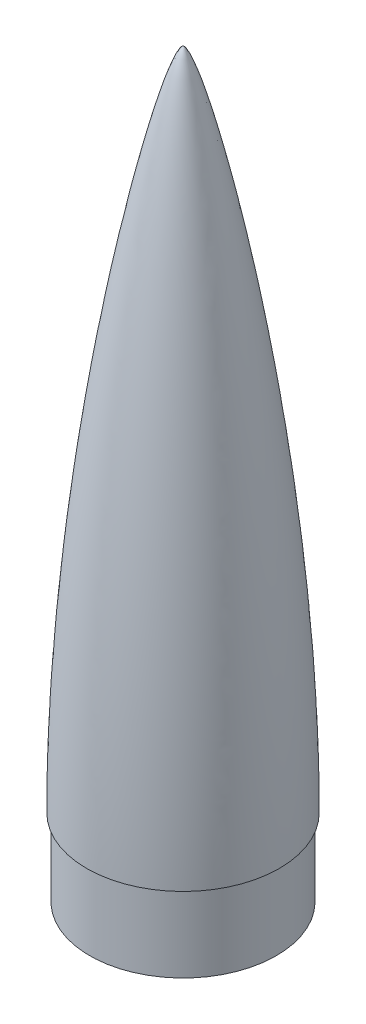
ISO-10303-21;
HEADER;
FILE_DESCRIPTION(('STEP AP214'),'2;1');
FILE_NAME('part.step','',(''),(''),'','','');
FILE_SCHEMA(('AUTOMOTIVE_DESIGN { 1 0 10303 214 1 1 1 1 }'));
ENDSEC;
DATA;
#1=APPLICATION_CONTEXT('core data for automotive mechanical design processes');
#2=APPLICATION_PROTOCOL_DEFINITION('international standard','automotive_design',2000,#1);
#3=PRODUCT_CONTEXT('',#1,'mechanical');
#4=PRODUCT('Part','Part','',(#3));
#5=PRODUCT_RELATED_PRODUCT_CATEGORY('part','',(#4));
#6=PRODUCT_DEFINITION_FORMATION('','',#4);
#7=PRODUCT_DEFINITION_CONTEXT('part definition',#1,'design');
#8=PRODUCT_DEFINITION('design','',#6,#7);
#9=PRODUCT_DEFINITION_SHAPE('','',#8);
#10=(LENGTH_UNIT() NAMED_UNIT(*) SI_UNIT(.MILLI.,.METRE.));
#11=(NAMED_UNIT(*) PLANE_ANGLE_UNIT() SI_UNIT($,.RADIAN.));
#12=(NAMED_UNIT(*) SI_UNIT($,.STERADIAN.) SOLID_ANGLE_UNIT());
#13=UNCERTAINTY_MEASURE_WITH_UNIT(LENGTH_MEASURE(1.E-05),#10,'distance_accuracy_value','');
#14=(GEOMETRIC_REPRESENTATION_CONTEXT(3) GLOBAL_UNCERTAINTY_ASSIGNED_CONTEXT((#13)) GLOBAL_UNIT_ASSIGNED_CONTEXT((#10,
#11,#12)) REPRESENTATION_CONTEXT('',''));
#15=CARTESIAN_POINT('',(0.,0.,0.));
#16=DIRECTION('',(0.,0.,1.));
#17=DIRECTION('',(1.,0.,0.));
#18=AXIS2_PLACEMENT_3D('',#15,#16,#17);
#19=CARTESIAN_POINT('',(32.5,26.,0.));
#20=CARTESIAN_POINT('',(32.5,136.,0.));
#21=CARTESIAN_POINT('',(5.,250.,0.));
#22=CARTESIAN_POINT('',(0.,250.,0.));
#23=B_SPLINE_CURVE_WITH_KNOTS('',3,(#19,#20,#21,#22),.UNSPECIFIED.,.F.,.F.,(4,4),(0.,1.),.UNSPECIFIED.);
#24=CARTESIAN_POINT('',(0.,0.,0.));
#25=DIRECTION('',(0.,-1.,0.));
#26=AXIS1_PLACEMENT('',#24,#25);
#27=SURFACE_OF_REVOLUTION('',#23,#26);
#28=CARTESIAN_POINT('',(0.,250.,0.));
#29=VERTEX_POINT('',#28);
#30=VERTEX_LOOP('',#29);
#31=FACE_BOUND('',#30,.T.);
#32=CARTESIAN_POINT('',(0.,26.,0.));
#33=DIRECTION('',(0.,-1.,0.));
#34=DIRECTION('',(0.,0.,-1.));
#35=AXIS2_PLACEMENT_3D('',#32,#33,#34);
#36=CIRCLE('',#35,32.5);
#37=CARTESIAN_POINT('',(0.,26.,-32.5));
#38=VERTEX_POINT('',#37);
#39=EDGE_CURVE('E11',#38,#38,#36,.T.);
#40=ORIENTED_EDGE('',*,*,#39,.F.);
#41=EDGE_LOOP('',(#40));
#42=FACE_BOUND('',#41,.T.);
#43=ADVANCED_FACE('F37',(#31,#42),#27,.F.);
#44=CARTESIAN_POINT('',(31.5,26.,0.));
#45=DIRECTION('',(0.,-1.,0.));
#46=DIRECTION('',(0.,0.,-1.));
#47=AXIS2_PLACEMENT_3D('',#44,#45,#46);
#48=PLANE('',#47);
#49=ORIENTED_EDGE('',*,*,#39,.T.);
#50=EDGE_LOOP('',(#49));
#51=FACE_BOUND('',#50,.T.);
#52=CARTESIAN_POINT('',(0.,26.,0.));
#53=DIRECTION('',(0.,-1.,0.));
#54=DIRECTION('',(0.,0.,-1.));
#55=AXIS2_PLACEMENT_3D('',#52,#53,#54);
#56=CIRCLE('',#55,31.5);
#57=CARTESIAN_POINT('',(0.,26.,-31.5));
#58=VERTEX_POINT('',#57);
#59=EDGE_CURVE('E44',#58,#58,#56,.T.);
#60=ORIENTED_EDGE('',*,*,#59,.F.);
#61=EDGE_LOOP('',(#60));
#62=FACE_BOUND('',#61,.T.);
#63=ADVANCED_FACE('F49',(#51,#62),#48,.T.);
#64=CARTESIAN_POINT('',(0.,0.,0.));
#65=DIRECTION('',(0.,-1.,0.));
#66=DIRECTION('',(0.,0.,-1.));
#67=AXIS2_PLACEMENT_3D('',#64,#65,#66);
#68=CYLINDRICAL_SURFACE('',#67,31.5);
#69=ORIENTED_EDGE('',*,*,#59,.T.);
#70=EDGE_LOOP('',(#69));
#71=FACE_BOUND('',#70,.T.);
#72=CARTESIAN_POINT('',(0.,0.,0.));
#73=DIRECTION('',(0.,-1.,0.));
#74=DIRECTION('',(0.,0.,-1.));
#75=AXIS2_PLACEMENT_3D('',#72,#73,#74);
#76=CIRCLE('',#75,31.5);
#77=CARTESIAN_POINT('',(0.,0.,-31.5));
#78=VERTEX_POINT('',#77);
#79=EDGE_CURVE('E58',#78,#78,#76,.T.);
#80=ORIENTED_EDGE('',*,*,#79,.F.);
#81=EDGE_LOOP('',(#80));
#82=FACE_BOUND('',#81,.T.);
#83=ADVANCED_FACE('F54',(#71,#82),#68,.T.);
#84=CARTESIAN_POINT('',(30.25,0.,0.));
#85=DIRECTION('',(0.,-1.,0.));
#86=DIRECTION('',(0.,0.,-1.));
#87=AXIS2_PLACEMENT_3D('',#84,#85,#86);
#88=PLANE('',#87);
#89=ORIENTED_EDGE('',*,*,#79,.T.);
#90=EDGE_LOOP('',(#89));
#91=FACE_BOUND('',#90,.T.);
#92=CARTESIAN_POINT('',(0.,0.,0.));
#93=DIRECTION('',(0.,-1.,0.));
#94=DIRECTION('',(0.,0.,-1.));
#95=AXIS2_PLACEMENT_3D('',#92,#93,#94);
#96=CIRCLE('',#95,30.25);
#97=CARTESIAN_POINT('',(0.,0.,-30.25));
#98=VERTEX_POINT('',#97);
#99=EDGE_CURVE('E60',#98,#98,#96,.T.);
#100=ORIENTED_EDGE('',*,*,#99,.F.);
#101=EDGE_LOOP('',(#100));
#102=FACE_BOUND('',#101,.T.);
#103=ADVANCED_FACE('F97',(#91,#102),#88,.T.);
#104=CARTESIAN_POINT('',(0.,0.,0.));
#105=DIRECTION('',(0.,-1.,0.));
#106=DIRECTION('',(0.,0.,-1.));
#107=AXIS2_PLACEMENT_3D('',#104,#105,#106);
#108=CYLINDRICAL_SURFACE('',#107,30.25);
#109=ORIENTED_EDGE('',*,*,#99,.T.);
#110=EDGE_LOOP('',(#109));
#111=FACE_BOUND('',#110,.T.);
#112=CARTESIAN_POINT('',(0.,27.25,0.));
#113=DIRECTION('',(0.,-1.,0.));
#114=DIRECTION('',(0.,0.,-1.));
#115=AXIS2_PLACEMENT_3D('',#112,#113,#114);
#116=CIRCLE('',#115,30.25);
#117=CARTESIAN_POINT('',(0.,27.25,-30.25));
#118=VERTEX_POINT('',#117);
#119=EDGE_CURVE('E65',#118,#118,#116,.T.);
#120=ORIENTED_EDGE('',*,*,#119,.F.);
#121=EDGE_LOOP('',(#120));
#122=FACE_BOUND('',#121,.T.);
#123=ADVANCED_FACE('F93',(#111,#122),#108,.F.);
#124=CARTESIAN_POINT('',(30.25,27.25,0.));
#125=DIRECTION('',(0.,1.,0.));
#126=DIRECTION('',(0.,0.,1.));
#127=AXIS2_PLACEMENT_3D('',#124,#125,#126);
#128=PLANE('',#127);
#129=ORIENTED_EDGE('',*,*,#119,.T.);
#130=EDGE_LOOP('',(#129));
#131=FACE_BOUND('',#130,.T.);
#132=CARTESIAN_POINT('',(0.,27.25,0.));
#133=DIRECTION('',(0.,-1.,0.));
#134=DIRECTION('',(0.,0.,-1.));
#135=AXIS2_PLACEMENT_3D('',#132,#133,#134);
#136=CIRCLE('',#135,31.0555501011905);
#137=CARTESIAN_POINT('',(0.,27.25,-31.0555501011905));
#138=VERTEX_POINT('',#137);
#139=EDGE_CURVE('E68',#138,#138,#136,.T.);
#140=ORIENTED_EDGE('',*,*,#139,.F.);
#141=EDGE_LOOP('',(#140));
#142=FACE_BOUND('',#141,.T.);
#143=ADVANCED_FACE('F89',(#131,#142),#128,.T.);
#144=CARTESIAN_POINT('',(9.25183733681375,217.362983303648,0.));
#145=CARTESIAN_POINT('',(16.8816936398217,189.386843525952,0.));
#146=CARTESIAN_POINT('',(32.5651477411004,97.0340663767651,0.));
#147=CARTESIAN_POINT('',(31.0555501011905,27.25,0.));
#148=B_SPLINE_CURVE_WITH_KNOTS('',3,(#144,#145,#146,#147),.UNSPECIFIED.,.F.,.F.,(4,4),(0.,1.),.UNSPECIFIED.);
#149=CARTESIAN_POINT('',(0.,0.,0.));
#150=DIRECTION('',(0.,-1.,0.));
#151=AXIS1_PLACEMENT('',#149,#150);
#152=SURFACE_OF_REVOLUTION('',#148,#151);
#153=ORIENTED_EDGE('',*,*,#139,.T.);
#154=EDGE_LOOP('',(#153));
#155=FACE_BOUND('',#154,.T.);
#156=CARTESIAN_POINT('',(0.,217.362983303648,0.));
#157=DIRECTION('',(0.,-1.,0.));
#158=DIRECTION('',(0.,0.,-1.));
#159=AXIS2_PLACEMENT_3D('',#156,#157,#158);
#160=CIRCLE('',#159,9.25183733681377);
#161=CARTESIAN_POINT('',(0.,217.362983303648,-9.25183733681377));
#162=VERTEX_POINT('',#161);
#163=EDGE_CURVE('E71',#162,#162,#160,.T.);
#164=ORIENTED_EDGE('',*,*,#163,.F.);
#165=EDGE_LOOP('',(#164));
#166=FACE_BOUND('',#165,.T.);
#167=ADVANCED_FACE('F84',(#155,#166),#152,.F.);
#168=CARTESIAN_POINT('',(0.,217.362983303648,0.));
#169=DIRECTION('',(0.,-1.,0.));
#170=DIRECTION('',(0.,0.,-1.));
#171=AXIS2_PLACEMENT_3D('',#168,#169,#170);
#172=PLANE('',#171);
#173=ORIENTED_EDGE('',*,*,#163,.T.);
#174=EDGE_LOOP('',(#173));
#175=FACE_BOUND('',#174,.T.);
#176=ADVANCED_FACE('F88',(#175),#172,.T.);
#177=CLOSED_SHELL('',(#43,#63,#83,#103,#123,#143,#167,#176));
#178=MANIFOLD_SOLID_BREP('B2',#177);
#179=ADVANCED_BREP_SHAPE_REPRESENTATION('',(#18,#178),#14);
#180=SHAPE_DEFINITION_REPRESENTATION(#9,#179);
ENDSEC;
END-ISO-10303-21;
